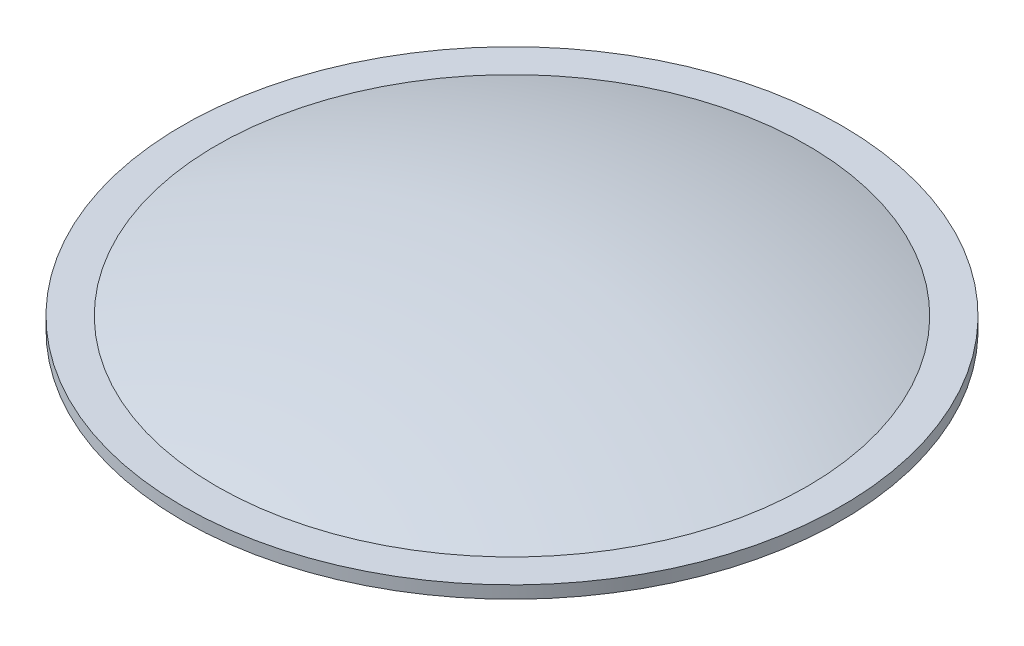
ISO-10303-21;
HEADER;
FILE_DESCRIPTION(('STEP AP214'),'2;1');
FILE_NAME('part.step','',(''),(''),'','','');
FILE_SCHEMA(('AUTOMOTIVE_DESIGN { 1 0 10303 214 1 1 1 1 }'));
ENDSEC;
DATA;
#1=APPLICATION_CONTEXT('core data for automotive mechanical design processes');
#2=APPLICATION_PROTOCOL_DEFINITION('international standard','automotive_design',2000,#1);
#3=PRODUCT_CONTEXT('',#1,'mechanical');
#4=PRODUCT('Part','Part','',(#3));
#5=PRODUCT_RELATED_PRODUCT_CATEGORY('part','',(#4));
#6=PRODUCT_DEFINITION_FORMATION('','',#4);
#7=PRODUCT_DEFINITION_CONTEXT('part definition',#1,'design');
#8=PRODUCT_DEFINITION('design','',#6,#7);
#9=PRODUCT_DEFINITION_SHAPE('','',#8);
#10=(LENGTH_UNIT() NAMED_UNIT(*) SI_UNIT(.MILLI.,.METRE.));
#11=(NAMED_UNIT(*) PLANE_ANGLE_UNIT() SI_UNIT($,.RADIAN.));
#12=(NAMED_UNIT(*) SI_UNIT($,.STERADIAN.) SOLID_ANGLE_UNIT());
#13=UNCERTAINTY_MEASURE_WITH_UNIT(LENGTH_MEASURE(1.E-05),#10,'distance_accuracy_value','');
#14=(GEOMETRIC_REPRESENTATION_CONTEXT(3) GLOBAL_UNCERTAINTY_ASSIGNED_CONTEXT((#13)) GLOBAL_UNIT_ASSIGNED_CONTEXT((#10,
#11,#12)) REPRESENTATION_CONTEXT('',''));
#15=CARTESIAN_POINT('',(0.,0.,0.));
#16=DIRECTION('',(0.,0.,1.));
#17=DIRECTION('',(1.,0.,0.));
#18=AXIS2_PLACEMENT_3D('',#15,#16,#17);
#19=CARTESIAN_POINT('',(0.,-67.3615857042535,0.));
#20=DIRECTION('',(0.,1.,0.));
#21=DIRECTION('',(1.,0.,0.));
#22=AXIS2_PLACEMENT_3D('',#19,#20,#21);
#23=SPHERICAL_SURFACE('',#22,72.35);
#24=CARTESIAN_POINT('',(0.,1.,0.));
#25=DIRECTION('',(0.,1.,0.));
#26=DIRECTION('',(0.,0.,1.));
#27=AXIS2_PLACEMENT_3D('',#24,#25,#26);
#28=CIRCLE('',#27,23.69);
#29=CARTESIAN_POINT('',(0.,1.,23.69));
#30=VERTEX_POINT('',#29);
#31=EDGE_CURVE('E47',#30,#30,#28,.T.);
#32=ORIENTED_EDGE('',*,*,#31,.T.);
#33=EDGE_LOOP('',(#32));
#34=FACE_BOUND('',#33,.T.);
#35=ADVANCED_FACE('F37',(#34),#23,.T.);
#36=CARTESIAN_POINT('',(0.,0.,0.));
#37=DIRECTION('',(0.,1.,0.));
#38=DIRECTION('',(0.,0.,1.));
#39=AXIS2_PLACEMENT_3D('',#36,#37,#38);
#40=PLANE('',#39);
#41=CARTESIAN_POINT('',(0.,0.,0.));
#42=DIRECTION('',(0.,1.,0.));
#43=DIRECTION('',(0.,0.,1.));
#44=AXIS2_PLACEMENT_3D('',#41,#42,#43);
#45=CIRCLE('',#44,26.43);
#46=CARTESIAN_POINT('',(0.,0.,26.43));
#47=VERTEX_POINT('',#46);
#48=EDGE_CURVE('E10',#47,#47,#45,.T.);
#49=ORIENTED_EDGE('',*,*,#48,.F.);
#50=EDGE_LOOP('',(#49));
#51=FACE_BOUND('',#50,.T.);
#52=ADVANCED_FACE('F62',(#51),#40,.F.);
#53=CARTESIAN_POINT('',(0.,49.2989997355276,0.));
#54=DIRECTION('',(0.,1.,0.));
#55=DIRECTION('',(0.,0.,1.));
#56=AXIS2_PLACEMENT_3D('',#53,#54,#55);
#57=CYLINDRICAL_SURFACE('',#56,26.43);
#58=CARTESIAN_POINT('',(0.,1.,0.));
#59=DIRECTION('',(0.,1.,0.));
#60=DIRECTION('',(0.,0.,1.));
#61=AXIS2_PLACEMENT_3D('',#58,#59,#60);
#62=CIRCLE('',#61,26.43);
#63=CARTESIAN_POINT('',(0.,1.,26.43));
#64=VERTEX_POINT('',#63);
#65=EDGE_CURVE('E43',#64,#64,#62,.T.);
#66=ORIENTED_EDGE('',*,*,#65,.F.);
#67=EDGE_LOOP('',(#66));
#68=FACE_BOUND('',#67,.T.);
#69=ORIENTED_EDGE('',*,*,#48,.T.);
#70=EDGE_LOOP('',(#69));
#71=FACE_BOUND('',#70,.T.);
#72=ADVANCED_FACE('F57',(#68,#71),#57,.T.);
#73=CARTESIAN_POINT('',(26.43,1.,0.));
#74=DIRECTION('',(0.,-1.,0.));
#75=DIRECTION('',(0.,0.,-1.));
#76=AXIS2_PLACEMENT_3D('',#73,#74,#75);
#77=PLANE('',#76);
#78=ORIENTED_EDGE('',*,*,#31,.F.);
#79=EDGE_LOOP('',(#78));
#80=FACE_BOUND('',#79,.T.);
#81=ORIENTED_EDGE('',*,*,#65,.T.);
#82=EDGE_LOOP('',(#81));
#83=FACE_BOUND('',#82,.T.);
#84=ADVANCED_FACE('F55',(#80,#83),#77,.F.);
#85=CLOSED_SHELL('',(#35,#52,#72,#84));
#86=MANIFOLD_SOLID_BREP('B2',#85);
#87=ADVANCED_BREP_SHAPE_REPRESENTATION('',(#18,#86),#14);
#88=SHAPE_DEFINITION_REPRESENTATION(#9,#87);
ENDSEC;
END-ISO-10303-21;
